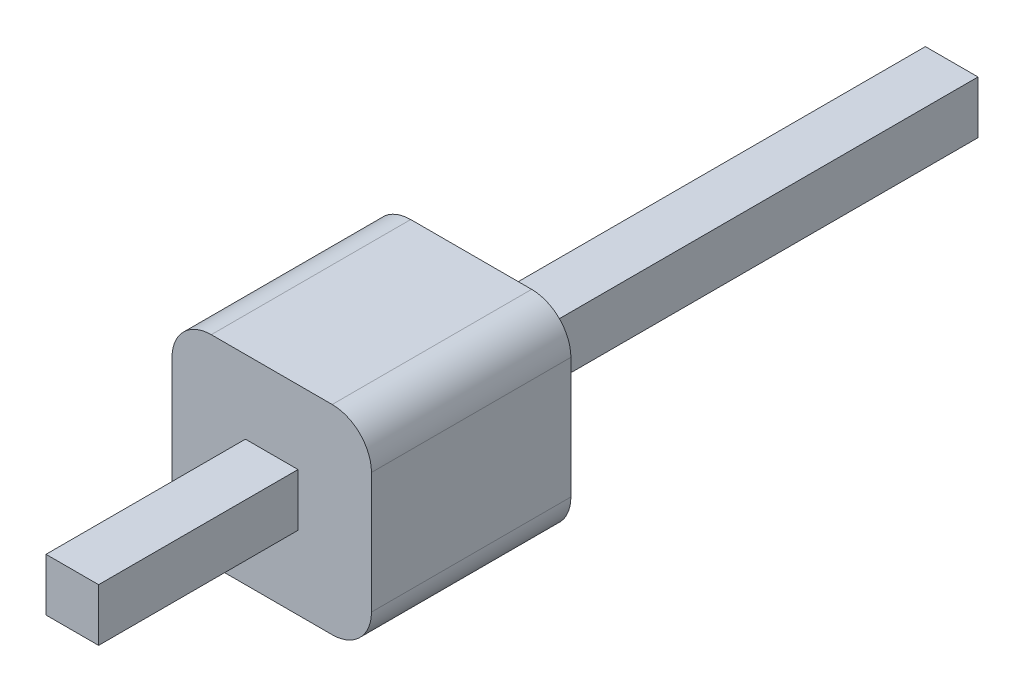
ISO-10303-21;
HEADER;
FILE_DESCRIPTION(('STEP AP214'),'2;1');
FILE_NAME('part.step','',(''),(''),'','','');
FILE_SCHEMA(('AUTOMOTIVE_DESIGN { 1 0 10303 214 1 1 1 1 }'));
ENDSEC;
DATA;
#1=APPLICATION_CONTEXT('core data for automotive mechanical design processes');
#2=APPLICATION_PROTOCOL_DEFINITION('international standard','automotive_design',2000,#1);
#3=PRODUCT_CONTEXT('',#1,'mechanical');
#4=PRODUCT('Part','Part','',(#3));
#5=PRODUCT_RELATED_PRODUCT_CATEGORY('part','',(#4));
#6=PRODUCT_DEFINITION_FORMATION('','',#4);
#7=PRODUCT_DEFINITION_CONTEXT('part definition',#1,'design');
#8=PRODUCT_DEFINITION('design','',#6,#7);
#9=PRODUCT_DEFINITION_SHAPE('','',#8);
#10=(LENGTH_UNIT() NAMED_UNIT(*) SI_UNIT(.MILLI.,.METRE.));
#11=(NAMED_UNIT(*) PLANE_ANGLE_UNIT() SI_UNIT($,.RADIAN.));
#12=(NAMED_UNIT(*) SI_UNIT($,.STERADIAN.) SOLID_ANGLE_UNIT());
#13=UNCERTAINTY_MEASURE_WITH_UNIT(LENGTH_MEASURE(1.E-05),#10,'distance_accuracy_value','');
#14=(GEOMETRIC_REPRESENTATION_CONTEXT(3) GLOBAL_UNCERTAINTY_ASSIGNED_CONTEXT((#13)) GLOBAL_UNIT_ASSIGNED_CONTEXT((#10,
#11,#12)) REPRESENTATION_CONTEXT('',''));
#15=CARTESIAN_POINT('',(0.,0.,0.));
#16=DIRECTION('',(0.,0.,1.));
#17=DIRECTION('',(1.,0.,0.));
#18=AXIS2_PLACEMENT_3D('',#15,#16,#17);
#19=CARTESIAN_POINT('',(-1.27,-1.27,2.54));
#20=DIRECTION('',(0.,0.,1.));
#21=DIRECTION('',(1.,0.,0.));
#22=AXIS2_PLACEMENT_3D('',#19,#20,#21);
#23=PLANE('',#22);
#24=DIRECTION('',(1.,0.,0.));
#25=VECTOR('',#24,1.);
#26=CARTESIAN_POINT('',(-1.27,-1.27,2.54));
#27=LINE('',#26,#25);
#28=CARTESIAN_POINT('',(-0.769999999999999,-1.27,2.54));
#29=VERTEX_POINT('',#28);
#30=CARTESIAN_POINT('',(0.770000000000001,-1.27,2.54));
#31=VERTEX_POINT('',#30);
#32=EDGE_CURVE('E193',#29,#31,#27,.T.);
#33=ORIENTED_EDGE('',*,*,#32,.T.);
#34=CARTESIAN_POINT('',(0.770000000000001,-0.77,2.54));
#35=DIRECTION('',(0.,0.,1.));
#36=DIRECTION('',(1.,0.,0.));
#37=AXIS2_PLACEMENT_3D('',#34,#35,#36);
#38=CIRCLE('',#37,0.5);
#39=CARTESIAN_POINT('',(1.27,-0.77,2.54));
#40=VERTEX_POINT('',#39);
#41=EDGE_CURVE('E242',#31,#40,#38,.T.);
#42=ORIENTED_EDGE('',*,*,#41,.T.);
#43=DIRECTION('',(0.,1.,0.));
#44=VECTOR('',#43,1.);
#45=CARTESIAN_POINT('',(1.27,1.27,2.54));
#46=LINE('',#45,#44);
#47=CARTESIAN_POINT('',(1.27,0.77,2.54));
#48=VERTEX_POINT('',#47);
#49=EDGE_CURVE('E197',#40,#48,#46,.T.);
#50=ORIENTED_EDGE('',*,*,#49,.T.);
#51=CARTESIAN_POINT('',(0.77,0.77,2.54));
#52=DIRECTION('',(0.,0.,1.));
#53=DIRECTION('',(1.,0.,0.));
#54=AXIS2_PLACEMENT_3D('',#51,#52,#53);
#55=CIRCLE('',#54,0.5);
#56=CARTESIAN_POINT('',(0.77,1.27,2.54));
#57=VERTEX_POINT('',#56);
#58=EDGE_CURVE('E54',#48,#57,#55,.T.);
#59=ORIENTED_EDGE('',*,*,#58,.T.);
#60=DIRECTION('',(-1.,0.,0.));
#61=VECTOR('',#60,1.);
#62=CARTESIAN_POINT('',(-1.27,1.27,2.54));
#63=LINE('',#62,#61);
#64=CARTESIAN_POINT('',(-0.769999999999999,1.27,2.54));
#65=VERTEX_POINT('',#64);
#66=EDGE_CURVE('E199',#57,#65,#63,.T.);
#67=ORIENTED_EDGE('',*,*,#66,.T.);
#68=CARTESIAN_POINT('',(-0.769999999999999,0.77,2.54));
#69=DIRECTION('',(0.,0.,1.));
#70=DIRECTION('',(1.,0.,0.));
#71=AXIS2_PLACEMENT_3D('',#68,#69,#70);
#72=CIRCLE('',#71,0.5);
#73=CARTESIAN_POINT('',(-1.27,0.77,2.54));
#74=VERTEX_POINT('',#73);
#75=EDGE_CURVE('E238',#65,#74,#72,.T.);
#76=ORIENTED_EDGE('',*,*,#75,.T.);
#77=DIRECTION('',(0.,-1.,0.));
#78=VECTOR('',#77,1.);
#79=CARTESIAN_POINT('',(-1.27,1.27,2.54));
#80=LINE('',#79,#78);
#81=CARTESIAN_POINT('',(-1.27,-0.77,2.54));
#82=VERTEX_POINT('',#81);
#83=EDGE_CURVE('E190',#74,#82,#80,.T.);
#84=ORIENTED_EDGE('',*,*,#83,.T.);
#85=CARTESIAN_POINT('',(-0.769999999999999,-0.77,2.54));
#86=DIRECTION('',(0.,0.,1.));
#87=DIRECTION('',(1.,0.,0.));
#88=AXIS2_PLACEMENT_3D('',#85,#86,#87);
#89=CIRCLE('',#88,0.5);
#90=EDGE_CURVE('E240',#82,#29,#89,.T.);
#91=ORIENTED_EDGE('',*,*,#90,.T.);
#92=EDGE_LOOP('',(#33,#42,#50,#59,#67,#76,#84,#91));
#93=FACE_BOUND('',#92,.T.);
#94=DIRECTION('',(1.,0.,0.));
#95=VECTOR('',#94,1.);
#96=CARTESIAN_POINT('',(-1.27,0.335000000000001,2.54));
#97=LINE('',#96,#95);
#98=CARTESIAN_POINT('',(-0.335,0.335000000000001,2.54));
#99=VERTEX_POINT('',#98);
#100=CARTESIAN_POINT('',(0.335,0.335,2.54));
#101=VERTEX_POINT('',#100);
#102=EDGE_CURVE('E172',#99,#101,#97,.T.);
#103=ORIENTED_EDGE('',*,*,#102,.T.);
#104=DIRECTION('',(0.,-1.,0.));
#105=VECTOR('',#104,1.);
#106=CARTESIAN_POINT('',(0.334999999999998,-1.27,2.54));
#107=LINE('',#106,#105);
#108=CARTESIAN_POINT('',(0.334999999999999,-0.335,2.54));
#109=VERTEX_POINT('',#108);
#110=EDGE_CURVE('E186',#101,#109,#107,.T.);
#111=ORIENTED_EDGE('',*,*,#110,.T.);
#112=DIRECTION('',(-1.,0.,0.));
#113=VECTOR('',#112,1.);
#114=CARTESIAN_POINT('',(-1.27,-0.334999999999999,2.54));
#115=LINE('',#114,#113);
#116=CARTESIAN_POINT('',(-0.335,-0.335,2.54));
#117=VERTEX_POINT('',#116);
#118=EDGE_CURVE('E183',#109,#117,#115,.T.);
#119=ORIENTED_EDGE('',*,*,#118,.T.);
#120=DIRECTION('',(0.,1.,0.));
#121=VECTOR('',#120,1.);
#122=CARTESIAN_POINT('',(-0.335,-1.27,2.54));
#123=LINE('',#122,#121);
#124=EDGE_CURVE('E176',#117,#99,#123,.T.);
#125=ORIENTED_EDGE('',*,*,#124,.T.);
#126=EDGE_LOOP('',(#103,#111,#119,#125));
#127=FACE_BOUND('',#126,.T.);
#128=ADVANCED_FACE('F34',(#93,#127),#23,.T.);
#129=CARTESIAN_POINT('',(-1.27,-1.27,0.));
#130=DIRECTION('',(0.,0.,1.));
#131=DIRECTION('',(1.,0.,0.));
#132=AXIS2_PLACEMENT_3D('',#129,#130,#131);
#133=PLANE('',#132);
#134=DIRECTION('',(0.,1.,0.));
#135=VECTOR('',#134,1.);
#136=CARTESIAN_POINT('',(1.27,1.27,0.));
#137=LINE('',#136,#135);
#138=CARTESIAN_POINT('',(1.27,-0.77,0.));
#139=VERTEX_POINT('',#138);
#140=CARTESIAN_POINT('',(1.27,0.77,0.));
#141=VERTEX_POINT('',#140);
#142=EDGE_CURVE('E207',#139,#141,#137,.T.);
#143=ORIENTED_EDGE('',*,*,#142,.F.);
#144=CARTESIAN_POINT('',(0.770000000000001,-0.77,0.));
#145=DIRECTION('',(0.,0.,1.));
#146=DIRECTION('',(1.,0.,0.));
#147=AXIS2_PLACEMENT_3D('',#144,#145,#146);
#148=CIRCLE('',#147,0.5);
#149=CARTESIAN_POINT('',(0.770000000000001,-1.27,0.));
#150=VERTEX_POINT('',#149);
#151=EDGE_CURVE('E230',#139,#150,#148,.F.);
#152=ORIENTED_EDGE('',*,*,#151,.T.);
#153=DIRECTION('',(1.,0.,0.));
#154=VECTOR('',#153,1.);
#155=CARTESIAN_POINT('',(-1.27,-1.27,0.));
#156=LINE('',#155,#154);
#157=CARTESIAN_POINT('',(-0.769999999999999,-1.27,0.));
#158=VERTEX_POINT('',#157);
#159=EDGE_CURVE('E204',#158,#150,#156,.T.);
#160=ORIENTED_EDGE('',*,*,#159,.F.);
#161=CARTESIAN_POINT('',(-0.769999999999999,-0.77,0.));
#162=DIRECTION('',(0.,0.,1.));
#163=DIRECTION('',(1.,0.,0.));
#164=AXIS2_PLACEMENT_3D('',#161,#162,#163);
#165=CIRCLE('',#164,0.5);
#166=CARTESIAN_POINT('',(-1.27,-0.77,0.));
#167=VERTEX_POINT('',#166);
#168=EDGE_CURVE('E228',#158,#167,#165,.F.);
#169=ORIENTED_EDGE('',*,*,#168,.T.);
#170=DIRECTION('',(0.,-1.,0.));
#171=VECTOR('',#170,1.);
#172=CARTESIAN_POINT('',(-1.27,1.27,0.));
#173=LINE('',#172,#171);
#174=CARTESIAN_POINT('',(-1.27,0.77,0.));
#175=VERTEX_POINT('',#174);
#176=EDGE_CURVE('E189',#175,#167,#173,.T.);
#177=ORIENTED_EDGE('',*,*,#176,.F.);
#178=CARTESIAN_POINT('',(-0.769999999999999,0.77,0.));
#179=DIRECTION('',(0.,0.,1.));
#180=DIRECTION('',(1.,0.,0.));
#181=AXIS2_PLACEMENT_3D('',#178,#179,#180);
#182=CIRCLE('',#181,0.5);
#183=CARTESIAN_POINT('',(-0.769999999999999,1.27,0.));
#184=VERTEX_POINT('',#183);
#185=EDGE_CURVE('E226',#175,#184,#182,.F.);
#186=ORIENTED_EDGE('',*,*,#185,.T.);
#187=DIRECTION('',(-1.,0.,0.));
#188=VECTOR('',#187,1.);
#189=CARTESIAN_POINT('',(-1.27,1.27,0.));
#190=LINE('',#189,#188);
#191=CARTESIAN_POINT('',(0.77,1.27,0.));
#192=VERTEX_POINT('',#191);
#193=EDGE_CURVE('E194',#192,#184,#190,.T.);
#194=ORIENTED_EDGE('',*,*,#193,.F.);
#195=CARTESIAN_POINT('',(0.77,0.77,0.));
#196=DIRECTION('',(0.,0.,1.));
#197=DIRECTION('',(1.,0.,0.));
#198=AXIS2_PLACEMENT_3D('',#195,#196,#197);
#199=CIRCLE('',#198,0.5);
#200=EDGE_CURVE('E224',#192,#141,#199,.F.);
#201=ORIENTED_EDGE('',*,*,#200,.T.);
#202=EDGE_LOOP('',(#143,#152,#160,#169,#177,#186,#194,#201));
#203=FACE_BOUND('',#202,.T.);
#204=DIRECTION('',(0.,-1.,0.));
#205=VECTOR('',#204,1.);
#206=CARTESIAN_POINT('',(0.334999999999998,-1.27,0.));
#207=LINE('',#206,#205);
#208=CARTESIAN_POINT('',(0.335,0.335000000000001,0.));
#209=VERTEX_POINT('',#208);
#210=CARTESIAN_POINT('',(0.334999999999999,-0.334999999999999,0.));
#211=VERTEX_POINT('',#210);
#212=EDGE_CURVE('E171',#209,#211,#207,.T.);
#213=ORIENTED_EDGE('',*,*,#212,.F.);
#214=DIRECTION('',(1.,0.,0.));
#215=VECTOR('',#214,1.);
#216=CARTESIAN_POINT('',(-1.27,0.335000000000001,0.));
#217=LINE('',#216,#215);
#218=CARTESIAN_POINT('',(-0.335,0.335000000000001,0.));
#219=VERTEX_POINT('',#218);
#220=EDGE_CURVE('E201',#219,#209,#217,.T.);
#221=ORIENTED_EDGE('',*,*,#220,.F.);
#222=DIRECTION('',(0.,1.,0.));
#223=VECTOR('',#222,1.);
#224=CARTESIAN_POINT('',(-0.335,-1.27,0.));
#225=LINE('',#224,#223);
#226=CARTESIAN_POINT('',(-0.335,-0.335,0.));
#227=VERTEX_POINT('',#226);
#228=EDGE_CURVE('E213',#227,#219,#225,.T.);
#229=ORIENTED_EDGE('',*,*,#228,.F.);
#230=DIRECTION('',(-1.,0.,0.));
#231=VECTOR('',#230,1.);
#232=CARTESIAN_POINT('',(-1.27,-0.334999999999999,0.));
#233=LINE('',#232,#231);
#234=EDGE_CURVE('E216',#211,#227,#233,.T.);
#235=ORIENTED_EDGE('',*,*,#234,.F.);
#236=EDGE_LOOP('',(#213,#221,#229,#235));
#237=FACE_BOUND('',#236,.T.);
#238=ADVANCED_FACE('F255',(#203,#237),#133,.F.);
#239=CARTESIAN_POINT('',(-1.27,1.27,2.54));
#240=DIRECTION('',(1.,0.,0.));
#241=DIRECTION('',(0.,0.,-1.));
#242=AXIS2_PLACEMENT_3D('',#239,#240,#241);
#243=PLANE('',#242);
#244=ORIENTED_EDGE('',*,*,#176,.T.);
#245=DIRECTION('',(0.,0.,-1.));
#246=VECTOR('',#245,1.);
#247=CARTESIAN_POINT('',(-1.27,-0.77,2.54));
#248=LINE('',#247,#246);
#249=EDGE_CURVE('E247',#167,#82,#248,.F.);
#250=ORIENTED_EDGE('',*,*,#249,.T.);
#251=ORIENTED_EDGE('',*,*,#83,.F.);
#252=DIRECTION('',(0.,0.,-1.));
#253=VECTOR('',#252,1.);
#254=CARTESIAN_POINT('',(-1.27,0.77,2.54));
#255=LINE('',#254,#253);
#256=EDGE_CURVE('E244',#74,#175,#255,.T.);
#257=ORIENTED_EDGE('',*,*,#256,.T.);
#258=EDGE_LOOP('',(#244,#250,#251,#257));
#259=FACE_BOUND('',#258,.T.);
#260=ADVANCED_FACE('F264',(#259),#243,.F.);
#261=CARTESIAN_POINT('',(-1.27,-1.27,2.54));
#262=DIRECTION('',(0.,1.,0.));
#263=DIRECTION('',(-1.,0.,0.));
#264=AXIS2_PLACEMENT_3D('',#261,#262,#263);
#265=PLANE('',#264);
#266=ORIENTED_EDGE('',*,*,#159,.T.);
#267=DIRECTION('',(0.,0.,-1.));
#268=VECTOR('',#267,1.);
#269=CARTESIAN_POINT('',(0.770000000000001,-1.27,2.54));
#270=LINE('',#269,#268);
#271=EDGE_CURVE('E235',#150,#31,#270,.F.);
#272=ORIENTED_EDGE('',*,*,#271,.T.);
#273=ORIENTED_EDGE('',*,*,#32,.F.);
#274=DIRECTION('',(0.,0.,-1.));
#275=VECTOR('',#274,1.);
#276=CARTESIAN_POINT('',(-0.769999999999999,-1.27,2.54));
#277=LINE('',#276,#275);
#278=EDGE_CURVE('E232',#29,#158,#277,.T.);
#279=ORIENTED_EDGE('',*,*,#278,.T.);
#280=EDGE_LOOP('',(#266,#272,#273,#279));
#281=FACE_BOUND('',#280,.T.);
#282=ADVANCED_FACE('F274',(#281),#265,.F.);
#283=CARTESIAN_POINT('',(1.27,1.27,2.54));
#284=DIRECTION('',(-1.,0.,0.));
#285=DIRECTION('',(0.,-1.,0.));
#286=AXIS2_PLACEMENT_3D('',#283,#284,#285);
#287=PLANE('',#286);
#288=ORIENTED_EDGE('',*,*,#49,.F.);
#289=DIRECTION('',(0.,0.,-1.));
#290=VECTOR('',#289,1.);
#291=CARTESIAN_POINT('',(1.27,-0.77,2.54));
#292=LINE('',#291,#290);
#293=EDGE_CURVE('E221',#40,#139,#292,.T.);
#294=ORIENTED_EDGE('',*,*,#293,.T.);
#295=ORIENTED_EDGE('',*,*,#142,.T.);
#296=DIRECTION('',(0.,0.,-1.));
#297=VECTOR('',#296,1.);
#298=CARTESIAN_POINT('',(1.27,0.77,2.54));
#299=LINE('',#298,#297);
#300=EDGE_CURVE('E219',#141,#48,#299,.F.);
#301=ORIENTED_EDGE('',*,*,#300,.T.);
#302=EDGE_LOOP('',(#288,#294,#295,#301));
#303=FACE_BOUND('',#302,.T.);
#304=ADVANCED_FACE('F282',(#303),#287,.F.);
#305=CARTESIAN_POINT('',(-1.27,1.27,2.54));
#306=DIRECTION('',(0.,-1.,0.));
#307=DIRECTION('',(1.,0.,0.));
#308=AXIS2_PLACEMENT_3D('',#305,#306,#307);
#309=PLANE('',#308);
#310=ORIENTED_EDGE('',*,*,#193,.T.);
#311=DIRECTION('',(0.,0.,-1.));
#312=VECTOR('',#311,1.);
#313=CARTESIAN_POINT('',(-0.769999999999999,1.27,2.54));
#314=LINE('',#313,#312);
#315=EDGE_CURVE('E11',#184,#65,#314,.F.);
#316=ORIENTED_EDGE('',*,*,#315,.T.);
#317=ORIENTED_EDGE('',*,*,#66,.F.);
#318=DIRECTION('',(0.,0.,-1.));
#319=VECTOR('',#318,1.);
#320=CARTESIAN_POINT('',(0.77,1.27,2.54));
#321=LINE('',#320,#319);
#322=EDGE_CURVE('E42',#57,#192,#321,.T.);
#323=ORIENTED_EDGE('',*,*,#322,.T.);
#324=EDGE_LOOP('',(#310,#316,#317,#323));
#325=FACE_BOUND('',#324,.T.);
#326=ADVANCED_FACE('F251',(#325),#309,.F.);
#327=CARTESIAN_POINT('',(0.335,0.335000000000001,-6.12));
#328=DIRECTION('',(0.,0.,-1.));
#329=DIRECTION('',(-1.,0.,0.));
#330=AXIS2_PLACEMENT_3D('',#327,#328,#329);
#331=PLANE('',#330);
#332=DIRECTION('',(0.,-1.,0.));
#333=VECTOR('',#332,1.);
#334=CARTESIAN_POINT('',(0.335,0.335000000000001,-6.12));
#335=LINE('',#334,#333);
#336=CARTESIAN_POINT('',(0.335,0.335000000000001,-6.12));
#337=VERTEX_POINT('',#336);
#338=CARTESIAN_POINT('',(0.334999999999999,-0.334999999999999,-6.12));
#339=VERTEX_POINT('',#338);
#340=EDGE_CURVE('E158',#337,#339,#335,.T.);
#341=ORIENTED_EDGE('',*,*,#340,.T.);
#342=DIRECTION('',(-1.,0.,0.));
#343=VECTOR('',#342,1.);
#344=CARTESIAN_POINT('',(0.334999999999999,-0.334999999999999,-6.12));
#345=LINE('',#344,#343);
#346=CARTESIAN_POINT('',(-0.335,-0.334999999999999,-6.12));
#347=VERTEX_POINT('',#346);
#348=EDGE_CURVE('E147',#339,#347,#345,.T.);
#349=ORIENTED_EDGE('',*,*,#348,.T.);
#350=DIRECTION('',(0.,1.,0.));
#351=VECTOR('',#350,1.);
#352=CARTESIAN_POINT('',(-0.335,0.335000000000002,-6.12));
#353=LINE('',#352,#351);
#354=CARTESIAN_POINT('',(-0.335,0.335000000000002,-6.12));
#355=VERTEX_POINT('',#354);
#356=EDGE_CURVE('E157',#347,#355,#353,.T.);
#357=ORIENTED_EDGE('',*,*,#356,.T.);
#358=DIRECTION('',(1.,0.,0.));
#359=VECTOR('',#358,1.);
#360=CARTESIAN_POINT('',(0.335,0.335000000000001,-6.12));
#361=LINE('',#360,#359);
#362=EDGE_CURVE('E163',#355,#337,#361,.T.);
#363=ORIENTED_EDGE('',*,*,#362,.T.);
#364=EDGE_LOOP('',(#341,#349,#357,#363));
#365=FACE_BOUND('',#364,.T.);
#366=ADVANCED_FACE('F161',(#365),#331,.T.);
#367=CARTESIAN_POINT('',(0.335,0.335000000000001,-6.12));
#368=DIRECTION('',(0.,-1.,0.));
#369=DIRECTION('',(1.,0.,0.));
#370=AXIS2_PLACEMENT_3D('',#367,#368,#369);
#371=PLANE('',#370);
#372=DIRECTION('',(0.,0.,1.));
#373=VECTOR('',#372,1.);
#374=CARTESIAN_POINT('',(-0.335,0.335000000000002,-6.12));
#375=LINE('',#374,#373);
#376=EDGE_CURVE('E454',#355,#219,#375,.T.);
#377=ORIENTED_EDGE('',*,*,#376,.T.);
#378=ORIENTED_EDGE('',*,*,#220,.T.);
#379=DIRECTION('',(0.,0.,1.));
#380=VECTOR('',#379,1.);
#381=CARTESIAN_POINT('',(0.335,0.335000000000001,-6.12));
#382=LINE('',#381,#380);
#383=EDGE_CURVE('E457',#337,#209,#382,.T.);
#384=ORIENTED_EDGE('',*,*,#383,.F.);
#385=ORIENTED_EDGE('',*,*,#362,.F.);
#386=EDGE_LOOP('',(#377,#378,#384,#385));
#387=FACE_BOUND('',#386,.T.);
#388=ADVANCED_FACE('F351',(#387),#371,.F.);
#389=CARTESIAN_POINT('',(-0.335,0.335000000000002,-6.12));
#390=DIRECTION('',(1.,0.,0.));
#391=DIRECTION('',(0.,0.,-1.));
#392=AXIS2_PLACEMENT_3D('',#389,#390,#391);
#393=PLANE('',#392);
#394=DIRECTION('',(0.,0.,1.));
#395=VECTOR('',#394,1.);
#396=CARTESIAN_POINT('',(-0.335,-0.334999999999999,-6.12));
#397=LINE('',#396,#395);
#398=EDGE_CURVE('E154',#347,#227,#397,.T.);
#399=ORIENTED_EDGE('',*,*,#398,.T.);
#400=ORIENTED_EDGE('',*,*,#228,.T.);
#401=ORIENTED_EDGE('',*,*,#376,.F.);
#402=ORIENTED_EDGE('',*,*,#356,.F.);
#403=EDGE_LOOP('',(#399,#400,#401,#402));
#404=FACE_BOUND('',#403,.T.);
#405=ADVANCED_FACE('F361',(#404),#393,.F.);
#406=CARTESIAN_POINT('',(0.334999999999999,-0.334999999999999,-6.12));
#407=DIRECTION('',(0.,1.,0.));
#408=DIRECTION('',(0.,0.,1.));
#409=AXIS2_PLACEMENT_3D('',#406,#407,#408);
#410=PLANE('',#409);
#411=DIRECTION('',(0.,0.,1.));
#412=VECTOR('',#411,1.);
#413=CARTESIAN_POINT('',(0.334999999999999,-0.334999999999999,-6.12));
#414=LINE('',#413,#412);
#415=EDGE_CURVE('E152',#339,#211,#414,.T.);
#416=ORIENTED_EDGE('',*,*,#415,.T.);
#417=ORIENTED_EDGE('',*,*,#234,.T.);
#418=ORIENTED_EDGE('',*,*,#398,.F.);
#419=ORIENTED_EDGE('',*,*,#348,.F.);
#420=EDGE_LOOP('',(#416,#417,#418,#419));
#421=FACE_BOUND('',#420,.T.);
#422=ADVANCED_FACE('F149',(#421),#410,.F.);
#423=CARTESIAN_POINT('',(0.335,0.335000000000001,-6.12));
#424=DIRECTION('',(-1.,0.,0.));
#425=DIRECTION('',(0.,-1.,0.));
#426=AXIS2_PLACEMENT_3D('',#423,#424,#425);
#427=PLANE('',#426);
#428=ORIENTED_EDGE('',*,*,#383,.T.);
#429=ORIENTED_EDGE('',*,*,#212,.T.);
#430=ORIENTED_EDGE('',*,*,#415,.F.);
#431=ORIENTED_EDGE('',*,*,#340,.F.);
#432=EDGE_LOOP('',(#428,#429,#430,#431));
#433=FACE_BOUND('',#432,.T.);
#434=ADVANCED_FACE('F170',(#433),#427,.F.);
#435=ORIENTED_EDGE('',*,*,#110,.F.);
#436=CARTESIAN_POINT('',(0.335,0.335,5.08));
#437=VERTEX_POINT('',#436);
#438=EDGE_CURVE('E460',#101,#437,#382,.T.);
#439=ORIENTED_EDGE('',*,*,#438,.T.);
#440=DIRECTION('',(0.,-1.,0.));
#441=VECTOR('',#440,1.);
#442=CARTESIAN_POINT('',(0.335,0.335,5.08));
#443=LINE('',#442,#441);
#444=CARTESIAN_POINT('',(0.334999999999999,-0.335,5.08));
#445=VERTEX_POINT('',#444);
#446=EDGE_CURVE('E469',#437,#445,#443,.T.);
#447=ORIENTED_EDGE('',*,*,#446,.T.);
#448=EDGE_CURVE('E173',#109,#445,#414,.T.);
#449=ORIENTED_EDGE('',*,*,#448,.F.);
#450=EDGE_LOOP('',(#435,#439,#447,#449));
#451=FACE_BOUND('',#450,.T.);
#452=ADVANCED_FACE('F295',(#451),#427,.F.);
#453=ORIENTED_EDGE('',*,*,#118,.F.);
#454=ORIENTED_EDGE('',*,*,#448,.T.);
#455=DIRECTION('',(-1.,0.,0.));
#456=VECTOR('',#455,1.);
#457=CARTESIAN_POINT('',(0.334999999999999,-0.335,5.08));
#458=LINE('',#457,#456);
#459=CARTESIAN_POINT('',(-0.335,-0.335,5.08));
#460=VERTEX_POINT('',#459);
#461=EDGE_CURVE('E466',#445,#460,#458,.T.);
#462=ORIENTED_EDGE('',*,*,#461,.T.);
#463=EDGE_CURVE('E455',#117,#460,#397,.T.);
#464=ORIENTED_EDGE('',*,*,#463,.F.);
#465=EDGE_LOOP('',(#453,#454,#462,#464));
#466=FACE_BOUND('',#465,.T.);
#467=ADVANCED_FACE('F358',(#466),#410,.F.);
#468=ORIENTED_EDGE('',*,*,#124,.F.);
#469=ORIENTED_EDGE('',*,*,#463,.T.);
#470=DIRECTION('',(0.,1.,0.));
#471=VECTOR('',#470,1.);
#472=CARTESIAN_POINT('',(-0.335,0.335,5.08));
#473=LINE('',#472,#471);
#474=CARTESIAN_POINT('',(-0.335,0.335,5.08));
#475=VERTEX_POINT('',#474);
#476=EDGE_CURVE('E463',#460,#475,#473,.T.);
#477=ORIENTED_EDGE('',*,*,#476,.T.);
#478=EDGE_CURVE('E456',#99,#475,#375,.T.);
#479=ORIENTED_EDGE('',*,*,#478,.F.);
#480=EDGE_LOOP('',(#468,#469,#477,#479));
#481=FACE_BOUND('',#480,.T.);
#482=ADVANCED_FACE('F348',(#481),#393,.F.);
#483=ORIENTED_EDGE('',*,*,#102,.F.);
#484=ORIENTED_EDGE('',*,*,#478,.T.);
#485=DIRECTION('',(1.,0.,0.));
#486=VECTOR('',#485,1.);
#487=CARTESIAN_POINT('',(0.335,0.335,5.08));
#488=LINE('',#487,#486);
#489=EDGE_CURVE('E167',#475,#437,#488,.T.);
#490=ORIENTED_EDGE('',*,*,#489,.T.);
#491=ORIENTED_EDGE('',*,*,#438,.F.);
#492=EDGE_LOOP('',(#483,#484,#490,#491));
#493=FACE_BOUND('',#492,.T.);
#494=ADVANCED_FACE('F339',(#493),#371,.F.);
#495=CARTESIAN_POINT('',(0.335,0.335,5.08));
#496=DIRECTION('',(0.,0.,-1.));
#497=DIRECTION('',(-1.,0.,0.));
#498=AXIS2_PLACEMENT_3D('',#495,#496,#497);
#499=PLANE('',#498);
#500=ORIENTED_EDGE('',*,*,#446,.F.);
#501=ORIENTED_EDGE('',*,*,#489,.F.);
#502=ORIENTED_EDGE('',*,*,#476,.F.);
#503=ORIENTED_EDGE('',*,*,#461,.F.);
#504=EDGE_LOOP('',(#500,#501,#502,#503));
#505=FACE_BOUND('',#504,.T.);
#506=ADVANCED_FACE('F308',(#505),#499,.F.);
#507=CARTESIAN_POINT('',(0.770000000000001,-0.77,2.54));
#508=DIRECTION('',(0.,0.,-1.));
#509=DIRECTION('',(-1.,0.,0.));
#510=AXIS2_PLACEMENT_3D('',#507,#508,#509);
#511=CYLINDRICAL_SURFACE('',#510,0.5);
#512=ORIENTED_EDGE('',*,*,#41,.F.);
#513=ORIENTED_EDGE('',*,*,#271,.F.);
#514=ORIENTED_EDGE('',*,*,#151,.F.);
#515=ORIENTED_EDGE('',*,*,#293,.F.);
#516=EDGE_LOOP('',(#512,#513,#514,#515));
#517=FACE_BOUND('',#516,.T.);
#518=ADVANCED_FACE('F279',(#517),#511,.T.);
#519=CARTESIAN_POINT('',(-0.769999999999999,-0.77,2.54));
#520=DIRECTION('',(0.,0.,-1.));
#521=DIRECTION('',(-1.,0.,0.));
#522=AXIS2_PLACEMENT_3D('',#519,#520,#521);
#523=CYLINDRICAL_SURFACE('',#522,0.5);
#524=ORIENTED_EDGE('',*,*,#90,.F.);
#525=ORIENTED_EDGE('',*,*,#249,.F.);
#526=ORIENTED_EDGE('',*,*,#168,.F.);
#527=ORIENTED_EDGE('',*,*,#278,.F.);
#528=EDGE_LOOP('',(#524,#525,#526,#527));
#529=FACE_BOUND('',#528,.T.);
#530=ADVANCED_FACE('F271',(#529),#523,.T.);
#531=CARTESIAN_POINT('',(-0.769999999999999,0.77,2.54));
#532=DIRECTION('',(0.,0.,-1.));
#533=DIRECTION('',(-1.,0.,0.));
#534=AXIS2_PLACEMENT_3D('',#531,#532,#533);
#535=CYLINDRICAL_SURFACE('',#534,0.5);
#536=ORIENTED_EDGE('',*,*,#75,.F.);
#537=ORIENTED_EDGE('',*,*,#315,.F.);
#538=ORIENTED_EDGE('',*,*,#185,.F.);
#539=ORIENTED_EDGE('',*,*,#256,.F.);
#540=EDGE_LOOP('',(#536,#537,#538,#539));
#541=FACE_BOUND('',#540,.T.);
#542=ADVANCED_FACE('F261',(#541),#535,.T.);
#543=CARTESIAN_POINT('',(0.77,0.77,2.54));
#544=DIRECTION('',(0.,0.,-1.));
#545=DIRECTION('',(-1.,0.,0.));
#546=AXIS2_PLACEMENT_3D('',#543,#544,#545);
#547=CYLINDRICAL_SURFACE('',#546,0.5);
#548=ORIENTED_EDGE('',*,*,#58,.F.);
#549=ORIENTED_EDGE('',*,*,#300,.F.);
#550=ORIENTED_EDGE('',*,*,#200,.F.);
#551=ORIENTED_EDGE('',*,*,#322,.F.);
#552=EDGE_LOOP('',(#548,#549,#550,#551));
#553=FACE_BOUND('',#552,.T.);
#554=ADVANCED_FACE('F36',(#553),#547,.T.);
#555=CLOSED_SHELL('',(#128,#238,#260,#282,#304,#326,#366,#388,#405,#422,#434,#452,#467,#482,
#494,#506,#518,#530,#542,#554));
#556=MANIFOLD_SOLID_BREP('B2',#555);
#557=ADVANCED_BREP_SHAPE_REPRESENTATION('',(#18,#556),#14);
#558=SHAPE_DEFINITION_REPRESENTATION(#9,#557);
ENDSEC;
END-ISO-10303-21;
